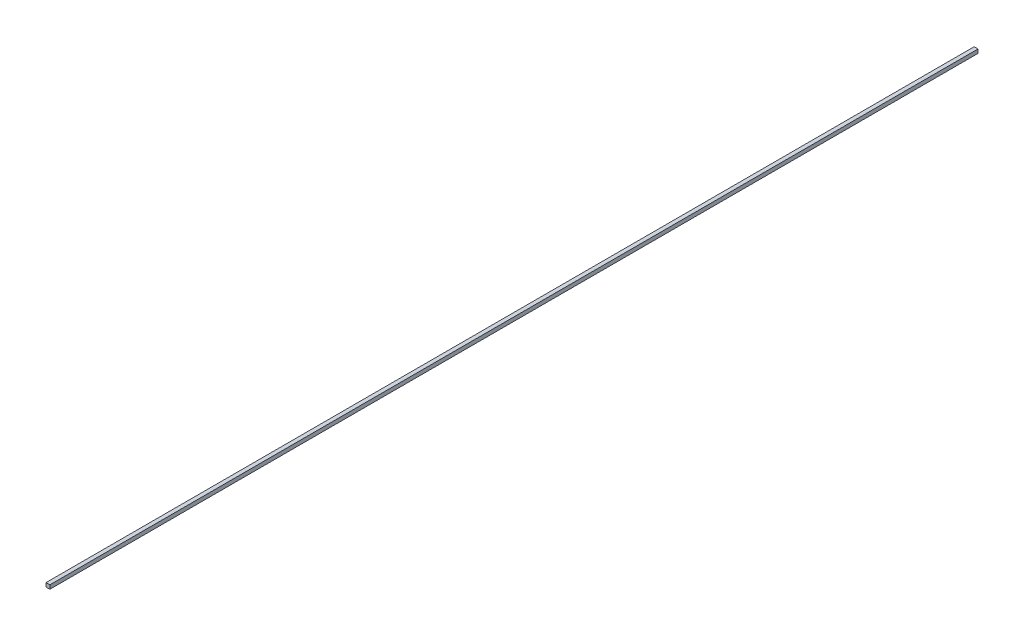
ISO-10303-21;
HEADER;
FILE_DESCRIPTION(('STEP AP214'),'2;1');
FILE_NAME('part.step','',(''),(''),'','','');
FILE_SCHEMA(('AUTOMOTIVE_DESIGN { 1 0 10303 214 1 1 1 1 }'));
ENDSEC;
DATA;
#1=APPLICATION_CONTEXT('core data for automotive mechanical design processes');
#2=APPLICATION_PROTOCOL_DEFINITION('international standard','automotive_design',2000,#1);
#3=PRODUCT_CONTEXT('',#1,'mechanical');
#4=PRODUCT('Part','Part','',(#3));
#5=PRODUCT_RELATED_PRODUCT_CATEGORY('part','',(#4));
#6=PRODUCT_DEFINITION_FORMATION('','',#4);
#7=PRODUCT_DEFINITION_CONTEXT('part definition',#1,'design');
#8=PRODUCT_DEFINITION('design','',#6,#7);
#9=PRODUCT_DEFINITION_SHAPE('','',#8);
#10=(LENGTH_UNIT() NAMED_UNIT(*) SI_UNIT(.MILLI.,.METRE.));
#11=(NAMED_UNIT(*) PLANE_ANGLE_UNIT() SI_UNIT($,.RADIAN.));
#12=(NAMED_UNIT(*) SI_UNIT($,.STERADIAN.) SOLID_ANGLE_UNIT());
#13=UNCERTAINTY_MEASURE_WITH_UNIT(LENGTH_MEASURE(1.E-05),#10,'distance_accuracy_value','');
#14=(GEOMETRIC_REPRESENTATION_CONTEXT(3) GLOBAL_UNCERTAINTY_ASSIGNED_CONTEXT((#13)) GLOBAL_UNIT_ASSIGNED_CONTEXT((#10,
#11,#12)) REPRESENTATION_CONTEXT('',''));
#15=CARTESIAN_POINT('',(0.,0.,0.));
#16=DIRECTION('',(0.,0.,1.));
#17=DIRECTION('',(1.,0.,0.));
#18=AXIS2_PLACEMENT_3D('',#15,#16,#17);
#19=CARTESIAN_POINT('',(12192.,10868.8293766007,-12192.));
#20=DIRECTION('',(0.,0.,1.));
#21=DIRECTION('',(1.,0.,0.));
#22=AXIS2_PLACEMENT_3D('',#19,#20,#21);
#23=PLANE('',#22);
#24=DIRECTION('',(-1.,0.,0.));
#25=VECTOR('',#24,1.);
#26=CARTESIAN_POINT('',(0.,0.,-12192.));
#27=LINE('',#26,#25);
#28=CARTESIAN_POINT('',(0.,0.,-12192.));
#29=VERTEX_POINT('',#28);
#30=CARTESIAN_POINT('',(-50.8,0.,-12192.));
#31=VERTEX_POINT('',#30);
#32=EDGE_CURVE('E92',#29,#31,#27,.T.);
#33=ORIENTED_EDGE('',*,*,#32,.T.);
#34=DIRECTION('',(0.,-1.,0.));
#35=VECTOR('',#34,1.);
#36=CARTESIAN_POINT('',(-50.8,0.,-12192.));
#37=LINE('',#36,#35);
#38=CARTESIAN_POINT('',(-50.8,50.8,-12192.));
#39=VERTEX_POINT('',#38);
#40=EDGE_CURVE('E54',#39,#31,#37,.T.);
#41=ORIENTED_EDGE('',*,*,#40,.F.);
#42=DIRECTION('',(1.,0.,0.));
#43=VECTOR('',#42,1.);
#44=CARTESIAN_POINT('',(0.,50.8,-12192.));
#45=LINE('',#44,#43);
#46=CARTESIAN_POINT('',(0.,50.8,-12192.));
#47=VERTEX_POINT('',#46);
#48=EDGE_CURVE('E38',#39,#47,#45,.T.);
#49=ORIENTED_EDGE('',*,*,#48,.T.);
#50=DIRECTION('',(0.,-1.,0.));
#51=VECTOR('',#50,1.);
#52=CARTESIAN_POINT('',(0.,50.8,-12192.));
#53=LINE('',#52,#51);
#54=EDGE_CURVE('E75',#47,#29,#53,.T.);
#55=ORIENTED_EDGE('',*,*,#54,.T.);
#56=EDGE_LOOP('',(#33,#41,#49,#55));
#57=FACE_BOUND('',#56,.T.);
#58=ADVANCED_FACE('F34',(#57),#23,.F.);
#59=CARTESIAN_POINT('',(0.,50.8,0.));
#60=DIRECTION('',(0.,1.,0.));
#61=DIRECTION('',(0.,0.,1.));
#62=AXIS2_PLACEMENT_3D('',#59,#60,#61);
#63=PLANE('',#62);
#64=DIRECTION('',(0.,0.,1.));
#65=VECTOR('',#64,1.);
#66=CARTESIAN_POINT('',(-50.8,50.8,0.));
#67=LINE('',#66,#65);
#68=CARTESIAN_POINT('',(-50.8,50.8,0.));
#69=VERTEX_POINT('',#68);
#70=EDGE_CURVE('E90',#39,#69,#67,.T.);
#71=ORIENTED_EDGE('',*,*,#70,.T.);
#72=DIRECTION('',(1.,0.,0.));
#73=VECTOR('',#72,1.);
#74=CARTESIAN_POINT('',(0.,50.8,0.));
#75=LINE('',#74,#73);
#76=CARTESIAN_POINT('',(0.,50.8,0.));
#77=VERTEX_POINT('',#76);
#78=EDGE_CURVE('E88',#69,#77,#75,.T.);
#79=ORIENTED_EDGE('',*,*,#78,.T.);
#80=DIRECTION('',(0.,0.,1.));
#81=VECTOR('',#80,1.);
#82=CARTESIAN_POINT('',(0.,50.8,0.));
#83=LINE('',#82,#81);
#84=EDGE_CURVE('E80',#47,#77,#83,.T.);
#85=ORIENTED_EDGE('',*,*,#84,.F.);
#86=ORIENTED_EDGE('',*,*,#48,.F.);
#87=EDGE_LOOP('',(#71,#79,#85,#86));
#88=FACE_BOUND('',#87,.T.);
#89=ADVANCED_FACE('F86',(#88),#63,.T.);
#90=CARTESIAN_POINT('',(0.,50.8,-12192.));
#91=DIRECTION('',(1.,0.,0.));
#92=DIRECTION('',(0.,0.,-1.));
#93=AXIS2_PLACEMENT_3D('',#90,#91,#92);
#94=PLANE('',#93);
#95=ORIENTED_EDGE('',*,*,#84,.T.);
#96=DIRECTION('',(0.,-1.,0.));
#97=VECTOR('',#96,1.);
#98=CARTESIAN_POINT('',(0.,50.8,0.));
#99=LINE('',#98,#97);
#100=CARTESIAN_POINT('',(0.,0.,0.));
#101=VERTEX_POINT('',#100);
#102=EDGE_CURVE('E95',#77,#101,#99,.T.);
#103=ORIENTED_EDGE('',*,*,#102,.T.);
#104=DIRECTION('',(0.,0.,1.));
#105=VECTOR('',#104,1.);
#106=CARTESIAN_POINT('',(0.,0.,0.));
#107=LINE('',#106,#105);
#108=EDGE_CURVE('E81',#29,#101,#107,.T.);
#109=ORIENTED_EDGE('',*,*,#108,.F.);
#110=ORIENTED_EDGE('',*,*,#54,.F.);
#111=EDGE_LOOP('',(#95,#103,#109,#110));
#112=FACE_BOUND('',#111,.T.);
#113=ADVANCED_FACE('F77',(#112),#94,.T.);
#114=CARTESIAN_POINT('',(0.,50.8,0.));
#115=DIRECTION('',(0.,0.,-1.));
#116=DIRECTION('',(-1.,0.,0.));
#117=AXIS2_PLACEMENT_3D('',#114,#115,#116);
#118=PLANE('',#117);
#119=ORIENTED_EDGE('',*,*,#78,.F.);
#120=DIRECTION('',(0.,1.,0.));
#121=VECTOR('',#120,1.);
#122=CARTESIAN_POINT('',(-50.8,0.,0.));
#123=LINE('',#122,#121);
#124=CARTESIAN_POINT('',(-50.8,0.,0.));
#125=VERTEX_POINT('',#124);
#126=EDGE_CURVE('E43',#125,#69,#123,.T.);
#127=ORIENTED_EDGE('',*,*,#126,.F.);
#128=DIRECTION('',(1.,0.,0.));
#129=VECTOR('',#128,1.);
#130=CARTESIAN_POINT('',(0.,0.,0.));
#131=LINE('',#130,#129);
#132=EDGE_CURVE('E98',#125,#101,#131,.T.);
#133=ORIENTED_EDGE('',*,*,#132,.T.);
#134=ORIENTED_EDGE('',*,*,#102,.F.);
#135=EDGE_LOOP('',(#119,#127,#133,#134));
#136=FACE_BOUND('',#135,.T.);
#137=ADVANCED_FACE('F108',(#136),#118,.F.);
#138=CARTESIAN_POINT('',(0.,0.,0.));
#139=DIRECTION('',(0.,-1.,0.));
#140=DIRECTION('',(0.,0.,-1.));
#141=AXIS2_PLACEMENT_3D('',#138,#139,#140);
#142=PLANE('',#141);
#143=ORIENTED_EDGE('',*,*,#32,.F.);
#144=ORIENTED_EDGE('',*,*,#108,.T.);
#145=ORIENTED_EDGE('',*,*,#132,.F.);
#146=DIRECTION('',(0.,0.,1.));
#147=VECTOR('',#146,1.);
#148=CARTESIAN_POINT('',(-50.8,0.,-12192.));
#149=LINE('',#148,#147);
#150=EDGE_CURVE('E11',#31,#125,#149,.T.);
#151=ORIENTED_EDGE('',*,*,#150,.F.);
#152=EDGE_LOOP('',(#143,#144,#145,#151));
#153=FACE_BOUND('',#152,.T.);
#154=ADVANCED_FACE('F105',(#153),#142,.T.);
#155=CARTESIAN_POINT('',(-50.8,0.,0.));
#156=DIRECTION('',(1.,0.,0.));
#157=DIRECTION('',(0.,0.,-1.));
#158=AXIS2_PLACEMENT_3D('',#155,#156,#157);
#159=PLANE('',#158);
#160=ORIENTED_EDGE('',*,*,#70,.F.);
#161=ORIENTED_EDGE('',*,*,#40,.T.);
#162=ORIENTED_EDGE('',*,*,#150,.T.);
#163=ORIENTED_EDGE('',*,*,#126,.T.);
#164=EDGE_LOOP('',(#160,#161,#162,#163));
#165=FACE_BOUND('',#164,.T.);
#166=ADVANCED_FACE('F36',(#165),#159,.F.);
#167=CLOSED_SHELL('',(#58,#89,#113,#137,#154,#166));
#168=MANIFOLD_SOLID_BREP('B2',#167);
#169=ADVANCED_BREP_SHAPE_REPRESENTATION('',(#18,#168),#14);
#170=SHAPE_DEFINITION_REPRESENTATION(#9,#169);
ENDSEC;
END-ISO-10303-21;
